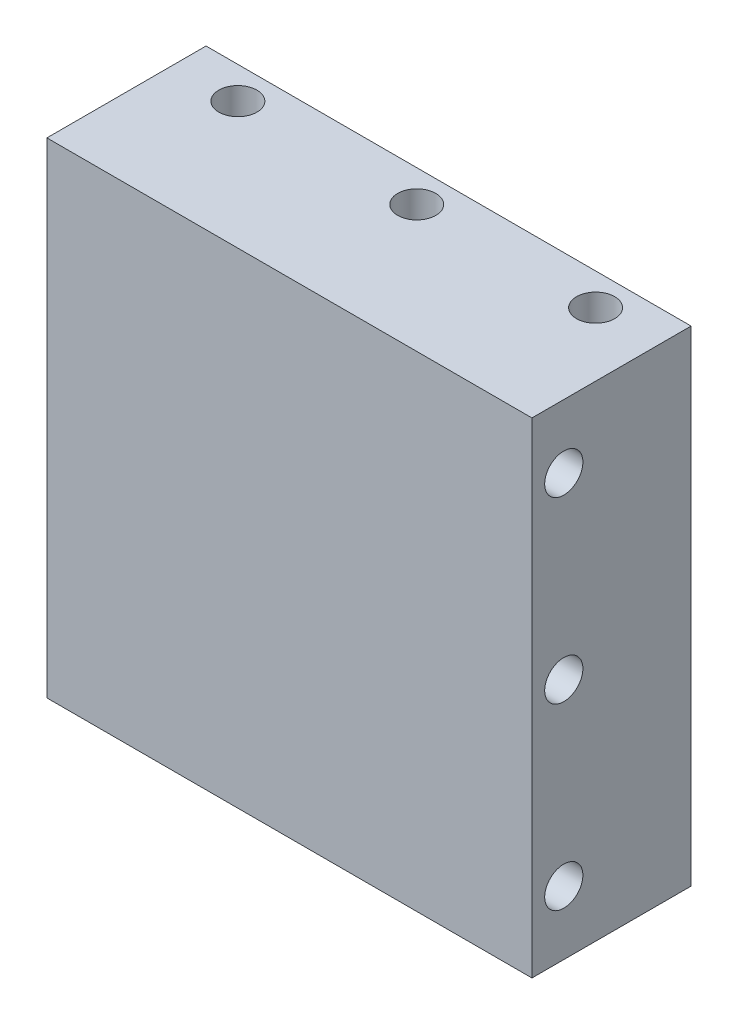
ISO-10303-21;
HEADER;
FILE_DESCRIPTION(('STEP AP214'),'2;1');
FILE_NAME('part.step','',(''),(''),'','','');
FILE_SCHEMA(('AUTOMOTIVE_DESIGN { 1 0 10303 214 1 1 1 1 }'));
ENDSEC;
DATA;
#1=APPLICATION_CONTEXT('core data for automotive mechanical design processes');
#2=APPLICATION_PROTOCOL_DEFINITION('international standard','automotive_design',2000,#1);
#3=PRODUCT_CONTEXT('',#1,'mechanical');
#4=PRODUCT('Part','Part','',(#3));
#5=PRODUCT_RELATED_PRODUCT_CATEGORY('part','',(#4));
#6=PRODUCT_DEFINITION_FORMATION('','',#4);
#7=PRODUCT_DEFINITION_CONTEXT('part definition',#1,'design');
#8=PRODUCT_DEFINITION('design','',#6,#7);
#9=PRODUCT_DEFINITION_SHAPE('','',#8);
#10=(LENGTH_UNIT() NAMED_UNIT(*) SI_UNIT(.MILLI.,.METRE.));
#11=(NAMED_UNIT(*) PLANE_ANGLE_UNIT() SI_UNIT($,.RADIAN.));
#12=(NAMED_UNIT(*) SI_UNIT($,.STERADIAN.) SOLID_ANGLE_UNIT());
#13=UNCERTAINTY_MEASURE_WITH_UNIT(LENGTH_MEASURE(1.E-05),#10,'distance_accuracy_value','');
#14=(GEOMETRIC_REPRESENTATION_CONTEXT(3) GLOBAL_UNCERTAINTY_ASSIGNED_CONTEXT((#13)) GLOBAL_UNIT_ASSIGNED_CONTEXT((#10,
#11,#12)) REPRESENTATION_CONTEXT('',''));
#15=CARTESIAN_POINT('',(0.,0.,0.));
#16=DIRECTION('',(0.,0.,1.));
#17=DIRECTION('',(1.,0.,0.));
#18=AXIS2_PLACEMENT_3D('',#15,#16,#17);
#19=CARTESIAN_POINT('',(76.2,76.2,50.));
#20=DIRECTION('',(-1.,0.,0.));
#21=DIRECTION('',(0.,-1.,0.));
#22=AXIS2_PLACEMENT_3D('',#19,#20,#21);
#23=PLANE('',#22);
#24=CARTESIAN_POINT('',(76.2,56.2,40.));
#25=DIRECTION('',(1.,0.,0.));
#26=DIRECTION('',(0.,1.,0.));
#27=AXIS2_PLACEMENT_3D('',#24,#25,#26);
#28=CIRCLE('',#27,5.99999999999999);
#29=CARTESIAN_POINT('',(76.2,62.2,40.));
#30=VERTEX_POINT('',#29);
#31=EDGE_CURVE('E129',#30,#30,#28,.T.);
#32=ORIENTED_EDGE('',*,*,#31,.F.);
#33=EDGE_LOOP('',(#32));
#34=FACE_BOUND('',#33,.T.);
#35=CARTESIAN_POINT('',(76.2,0.,40.));
#36=DIRECTION('',(1.,0.,0.));
#37=DIRECTION('',(0.,1.,0.));
#38=AXIS2_PLACEMENT_3D('',#35,#36,#37);
#39=CIRCLE('',#38,5.99999999999999);
#40=CARTESIAN_POINT('',(76.2,6.00000000000002,40.));
#41=VERTEX_POINT('',#40);
#42=EDGE_CURVE('E123',#41,#41,#39,.T.);
#43=ORIENTED_EDGE('',*,*,#42,.F.);
#44=EDGE_LOOP('',(#43));
#45=FACE_BOUND('',#44,.T.);
#46=CARTESIAN_POINT('',(76.2,-56.2,40.));
#47=DIRECTION('',(1.,0.,0.));
#48=DIRECTION('',(0.,1.,0.));
#49=AXIS2_PLACEMENT_3D('',#46,#47,#48);
#50=CIRCLE('',#49,6.00000000000001);
#51=CARTESIAN_POINT('',(76.2,-50.2,40.));
#52=VERTEX_POINT('',#51);
#53=EDGE_CURVE('E116',#52,#52,#50,.T.);
#54=ORIENTED_EDGE('',*,*,#53,.F.);
#55=EDGE_LOOP('',(#54));
#56=FACE_BOUND('',#55,.T.);
#57=DIRECTION('',(0.,1.,0.));
#58=VECTOR('',#57,1.);
#59=CARTESIAN_POINT('',(76.2,76.2,0.));
#60=LINE('',#59,#58);
#61=CARTESIAN_POINT('',(76.2,-76.2,0.));
#62=VERTEX_POINT('',#61);
#63=CARTESIAN_POINT('',(76.2,76.2,0.));
#64=VERTEX_POINT('',#63);
#65=EDGE_CURVE('E102',#62,#64,#60,.T.);
#66=ORIENTED_EDGE('',*,*,#65,.T.);
#67=DIRECTION('',(0.,0.,-1.));
#68=VECTOR('',#67,1.);
#69=CARTESIAN_POINT('',(76.2,76.2,50.));
#70=LINE('',#69,#68);
#71=CARTESIAN_POINT('',(76.2,76.2,50.));
#72=VERTEX_POINT('',#71);
#73=EDGE_CURVE('E11',#72,#64,#70,.T.);
#74=ORIENTED_EDGE('',*,*,#73,.F.);
#75=DIRECTION('',(0.,1.,0.));
#76=VECTOR('',#75,1.);
#77=CARTESIAN_POINT('',(76.2,76.2,50.));
#78=LINE('',#77,#76);
#79=CARTESIAN_POINT('',(76.2,-76.2,50.));
#80=VERTEX_POINT('',#79);
#81=EDGE_CURVE('E90',#80,#72,#78,.T.);
#82=ORIENTED_EDGE('',*,*,#81,.F.);
#83=DIRECTION('',(0.,0.,-1.));
#84=VECTOR('',#83,1.);
#85=CARTESIAN_POINT('',(76.2,-76.2,50.));
#86=LINE('',#85,#84);
#87=EDGE_CURVE('E98',#80,#62,#86,.T.);
#88=ORIENTED_EDGE('',*,*,#87,.T.);
#89=EDGE_LOOP('',(#66,#74,#82,#88));
#90=FACE_BOUND('',#89,.T.);
#91=ADVANCED_FACE('F39',(#34,#45,#56,#90),#23,.F.);
#92=CARTESIAN_POINT('',(-76.2,76.2,50.));
#93=DIRECTION('',(0.,-1.,0.));
#94=DIRECTION('',(0.,0.,-1.));
#95=AXIS2_PLACEMENT_3D('',#92,#93,#94);
#96=PLANE('',#95);
#97=CARTESIAN_POINT('',(-56.2,76.2,10.));
#98=DIRECTION('',(0.,1.,0.));
#99=DIRECTION('',(0.,0.,1.));
#100=AXIS2_PLACEMENT_3D('',#97,#98,#99);
#101=CIRCLE('',#100,6.);
#102=CARTESIAN_POINT('',(-56.2,76.2,16.));
#103=VERTEX_POINT('',#102);
#104=EDGE_CURVE('E146',#103,#103,#101,.T.);
#105=ORIENTED_EDGE('',*,*,#104,.F.);
#106=EDGE_LOOP('',(#105));
#107=FACE_BOUND('',#106,.T.);
#108=CARTESIAN_POINT('',(0.,76.2,10.));
#109=DIRECTION('',(0.,1.,0.));
#110=DIRECTION('',(0.,0.,1.));
#111=AXIS2_PLACEMENT_3D('',#108,#109,#110);
#112=CIRCLE('',#111,6.);
#113=CARTESIAN_POINT('',(0.,76.2,16.));
#114=VERTEX_POINT('',#113);
#115=EDGE_CURVE('E140',#114,#114,#112,.T.);
#116=ORIENTED_EDGE('',*,*,#115,.F.);
#117=EDGE_LOOP('',(#116));
#118=FACE_BOUND('',#117,.T.);
#119=CARTESIAN_POINT('',(56.2,76.2,10.));
#120=DIRECTION('',(0.,1.,0.));
#121=DIRECTION('',(0.,0.,1.));
#122=AXIS2_PLACEMENT_3D('',#119,#120,#121);
#123=CIRCLE('',#122,6.);
#124=CARTESIAN_POINT('',(56.2,76.2,16.));
#125=VERTEX_POINT('',#124);
#126=EDGE_CURVE('E134',#125,#125,#123,.T.);
#127=ORIENTED_EDGE('',*,*,#126,.F.);
#128=EDGE_LOOP('',(#127));
#129=FACE_BOUND('',#128,.T.);
#130=DIRECTION('',(-1.,0.,0.));
#131=VECTOR('',#130,1.);
#132=CARTESIAN_POINT('',(-76.2,76.2,0.));
#133=LINE('',#132,#131);
#134=CARTESIAN_POINT('',(-76.2,76.2,0.));
#135=VERTEX_POINT('',#134);
#136=EDGE_CURVE('E94',#64,#135,#133,.T.);
#137=ORIENTED_EDGE('',*,*,#136,.T.);
#138=DIRECTION('',(0.,0.,-1.));
#139=VECTOR('',#138,1.);
#140=CARTESIAN_POINT('',(-76.2,76.2,50.));
#141=LINE('',#140,#139);
#142=CARTESIAN_POINT('',(-76.2,76.2,50.));
#143=VERTEX_POINT('',#142);
#144=EDGE_CURVE('E47',#143,#135,#141,.T.);
#145=ORIENTED_EDGE('',*,*,#144,.F.);
#146=DIRECTION('',(-1.,0.,0.));
#147=VECTOR('',#146,1.);
#148=CARTESIAN_POINT('',(-76.2,76.2,50.));
#149=LINE('',#148,#147);
#150=EDGE_CURVE('E85',#72,#143,#149,.T.);
#151=ORIENTED_EDGE('',*,*,#150,.F.);
#152=ORIENTED_EDGE('',*,*,#73,.T.);
#153=EDGE_LOOP('',(#137,#145,#151,#152));
#154=FACE_BOUND('',#153,.T.);
#155=ADVANCED_FACE('F93',(#107,#118,#129,#154),#96,.F.);
#156=CARTESIAN_POINT('',(-76.2,76.2,50.));
#157=DIRECTION('',(1.,0.,0.));
#158=DIRECTION('',(0.,1.,0.));
#159=AXIS2_PLACEMENT_3D('',#156,#157,#158);
#160=PLANE('',#159);
#161=CARTESIAN_POINT('',(-76.2,56.2,40.));
#162=DIRECTION('',(1.,0.,0.));
#163=DIRECTION('',(0.,1.,0.));
#164=AXIS2_PLACEMENT_3D('',#161,#162,#163);
#165=CIRCLE('',#164,5.99999999999999);
#166=CARTESIAN_POINT('',(-76.2,62.2,40.));
#167=VERTEX_POINT('',#166);
#168=EDGE_CURVE('E105',#167,#167,#165,.T.);
#169=ORIENTED_EDGE('',*,*,#168,.T.);
#170=EDGE_LOOP('',(#169));
#171=FACE_BOUND('',#170,.T.);
#172=CARTESIAN_POINT('',(-76.2,0.,40.));
#173=DIRECTION('',(1.,0.,0.));
#174=DIRECTION('',(0.,1.,0.));
#175=AXIS2_PLACEMENT_3D('',#172,#173,#174);
#176=CIRCLE('',#175,5.99999999999999);
#177=CARTESIAN_POINT('',(-76.2,6.,40.));
#178=VERTEX_POINT('',#177);
#179=EDGE_CURVE('E126',#178,#178,#176,.T.);
#180=ORIENTED_EDGE('',*,*,#179,.T.);
#181=EDGE_LOOP('',(#180));
#182=FACE_BOUND('',#181,.T.);
#183=CARTESIAN_POINT('',(-76.2,-56.2,40.));
#184=DIRECTION('',(1.,0.,0.));
#185=DIRECTION('',(0.,1.,0.));
#186=AXIS2_PLACEMENT_3D('',#183,#184,#185);
#187=CIRCLE('',#186,6.00000000000001);
#188=CARTESIAN_POINT('',(-76.2,-50.2,40.));
#189=VERTEX_POINT('',#188);
#190=EDGE_CURVE('E119',#189,#189,#187,.T.);
#191=ORIENTED_EDGE('',*,*,#190,.T.);
#192=EDGE_LOOP('',(#191));
#193=FACE_BOUND('',#192,.T.);
#194=DIRECTION('',(0.,-1.,0.));
#195=VECTOR('',#194,1.);
#196=CARTESIAN_POINT('',(-76.2,76.2,0.));
#197=LINE('',#196,#195);
#198=CARTESIAN_POINT('',(-76.2,-76.2,0.));
#199=VERTEX_POINT('',#198);
#200=EDGE_CURVE('E72',#135,#199,#197,.T.);
#201=ORIENTED_EDGE('',*,*,#200,.T.);
#202=DIRECTION('',(0.,0.,-1.));
#203=VECTOR('',#202,1.);
#204=CARTESIAN_POINT('',(-76.2,-76.2,50.));
#205=LINE('',#204,#203);
#206=CARTESIAN_POINT('',(-76.2,-76.2,50.));
#207=VERTEX_POINT('',#206);
#208=EDGE_CURVE('E95',#207,#199,#205,.T.);
#209=ORIENTED_EDGE('',*,*,#208,.F.);
#210=DIRECTION('',(0.,-1.,0.));
#211=VECTOR('',#210,1.);
#212=CARTESIAN_POINT('',(-76.2,76.2,50.));
#213=LINE('',#212,#211);
#214=EDGE_CURVE('E88',#143,#207,#213,.T.);
#215=ORIENTED_EDGE('',*,*,#214,.F.);
#216=ORIENTED_EDGE('',*,*,#144,.T.);
#217=EDGE_LOOP('',(#201,#209,#215,#216));
#218=FACE_BOUND('',#217,.T.);
#219=ADVANCED_FACE('F96',(#171,#182,#193,#218),#160,.F.);
#220=CARTESIAN_POINT('',(-76.2,-76.2,50.));
#221=DIRECTION('',(0.,1.,0.));
#222=DIRECTION('',(0.,0.,1.));
#223=AXIS2_PLACEMENT_3D('',#220,#221,#222);
#224=PLANE('',#223);
#225=CARTESIAN_POINT('',(-56.2,-76.2,10.));
#226=DIRECTION('',(0.,1.,0.));
#227=DIRECTION('',(0.,0.,1.));
#228=AXIS2_PLACEMENT_3D('',#225,#226,#227);
#229=CIRCLE('',#228,6.);
#230=CARTESIAN_POINT('',(-56.2,-76.2,16.));
#231=VERTEX_POINT('',#230);
#232=EDGE_CURVE('E120',#231,#231,#229,.T.);
#233=ORIENTED_EDGE('',*,*,#232,.T.);
#234=EDGE_LOOP('',(#233));
#235=FACE_BOUND('',#234,.T.);
#236=CARTESIAN_POINT('',(0.,-76.2,10.));
#237=DIRECTION('',(0.,1.,0.));
#238=DIRECTION('',(0.,0.,1.));
#239=AXIS2_PLACEMENT_3D('',#236,#237,#238);
#240=CIRCLE('',#239,6.);
#241=CARTESIAN_POINT('',(0.,-76.2,16.));
#242=VERTEX_POINT('',#241);
#243=EDGE_CURVE('E143',#242,#242,#240,.T.);
#244=ORIENTED_EDGE('',*,*,#243,.T.);
#245=EDGE_LOOP('',(#244));
#246=FACE_BOUND('',#245,.T.);
#247=CARTESIAN_POINT('',(56.2,-76.2,10.));
#248=DIRECTION('',(0.,1.,0.));
#249=DIRECTION('',(0.,0.,1.));
#250=AXIS2_PLACEMENT_3D('',#247,#248,#249);
#251=CIRCLE('',#250,6.);
#252=CARTESIAN_POINT('',(56.2,-76.2,16.));
#253=VERTEX_POINT('',#252);
#254=EDGE_CURVE('E137',#253,#253,#251,.T.);
#255=ORIENTED_EDGE('',*,*,#254,.T.);
#256=EDGE_LOOP('',(#255));
#257=FACE_BOUND('',#256,.T.);
#258=DIRECTION('',(1.,0.,0.));
#259=VECTOR('',#258,1.);
#260=CARTESIAN_POINT('',(-76.2,-76.2,0.));
#261=LINE('',#260,#259);
#262=EDGE_CURVE('E78',#199,#62,#261,.T.);
#263=ORIENTED_EDGE('',*,*,#262,.T.);
#264=ORIENTED_EDGE('',*,*,#87,.F.);
#265=DIRECTION('',(1.,0.,0.));
#266=VECTOR('',#265,1.);
#267=CARTESIAN_POINT('',(-76.2,-76.2,50.));
#268=LINE('',#267,#266);
#269=EDGE_CURVE('E55',#207,#80,#268,.T.);
#270=ORIENTED_EDGE('',*,*,#269,.F.);
#271=ORIENTED_EDGE('',*,*,#208,.T.);
#272=EDGE_LOOP('',(#263,#264,#270,#271));
#273=FACE_BOUND('',#272,.T.);
#274=ADVANCED_FACE('F110',(#235,#246,#257,#273),#224,.F.);
#275=CARTESIAN_POINT('',(0.,0.,50.));
#276=DIRECTION('',(0.,0.,1.));
#277=DIRECTION('',(1.,0.,0.));
#278=AXIS2_PLACEMENT_3D('',#275,#276,#277);
#279=PLANE('',#278);
#280=ORIENTED_EDGE('',*,*,#81,.T.);
#281=ORIENTED_EDGE('',*,*,#150,.T.);
#282=ORIENTED_EDGE('',*,*,#214,.T.);
#283=ORIENTED_EDGE('',*,*,#269,.T.);
#284=EDGE_LOOP('',(#280,#281,#282,#283));
#285=FACE_BOUND('',#284,.T.);
#286=ADVANCED_FACE('F86',(#285),#279,.T.);
#287=CARTESIAN_POINT('',(0.,0.,0.));
#288=DIRECTION('',(0.,0.,1.));
#289=DIRECTION('',(1.,0.,0.));
#290=AXIS2_PLACEMENT_3D('',#287,#288,#289);
#291=PLANE('',#290);
#292=ORIENTED_EDGE('',*,*,#65,.F.);
#293=ORIENTED_EDGE('',*,*,#262,.F.);
#294=ORIENTED_EDGE('',*,*,#200,.F.);
#295=ORIENTED_EDGE('',*,*,#136,.F.);
#296=EDGE_LOOP('',(#292,#293,#294,#295));
#297=FACE_BOUND('',#296,.T.);
#298=ADVANCED_FACE('F113',(#297),#291,.F.);
#299=CARTESIAN_POINT('',(-76.2,-56.2,40.));
#300=DIRECTION('',(1.,0.,0.));
#301=DIRECTION('',(0.,1.,0.));
#302=AXIS2_PLACEMENT_3D('',#299,#300,#301);
#303=CYLINDRICAL_SURFACE('',#302,6.00000000000001);
#304=ORIENTED_EDGE('',*,*,#190,.F.);
#305=EDGE_LOOP('',(#304));
#306=FACE_BOUND('',#305,.T.);
#307=ORIENTED_EDGE('',*,*,#53,.T.);
#308=EDGE_LOOP('',(#307));
#309=FACE_BOUND('',#308,.T.);
#310=ADVANCED_FACE('F192',(#306,#309),#303,.F.);
#311=CARTESIAN_POINT('',(-76.2,0.,40.));
#312=DIRECTION('',(1.,0.,0.));
#313=DIRECTION('',(0.,1.,0.));
#314=AXIS2_PLACEMENT_3D('',#311,#312,#313);
#315=CYLINDRICAL_SURFACE('',#314,5.99999999999999);
#316=ORIENTED_EDGE('',*,*,#179,.F.);
#317=EDGE_LOOP('',(#316));
#318=FACE_BOUND('',#317,.T.);
#319=ORIENTED_EDGE('',*,*,#42,.T.);
#320=EDGE_LOOP('',(#319));
#321=FACE_BOUND('',#320,.T.);
#322=ADVANCED_FACE('F178',(#318,#321),#315,.F.);
#323=CARTESIAN_POINT('',(-76.2,56.2,40.));
#324=DIRECTION('',(1.,0.,0.));
#325=DIRECTION('',(0.,1.,0.));
#326=AXIS2_PLACEMENT_3D('',#323,#324,#325);
#327=CYLINDRICAL_SURFACE('',#326,5.99999999999999);
#328=ORIENTED_EDGE('',*,*,#168,.F.);
#329=EDGE_LOOP('',(#328));
#330=FACE_BOUND('',#329,.T.);
#331=ORIENTED_EDGE('',*,*,#31,.T.);
#332=EDGE_LOOP('',(#331));
#333=FACE_BOUND('',#332,.T.);
#334=ADVANCED_FACE('F169',(#330,#333),#327,.F.);
#335=CARTESIAN_POINT('',(56.2,-76.2,10.));
#336=DIRECTION('',(0.,1.,0.));
#337=DIRECTION('',(0.,0.,1.));
#338=AXIS2_PLACEMENT_3D('',#335,#336,#337);
#339=CYLINDRICAL_SURFACE('',#338,6.);
#340=CARTESIAN_POINT('',(56.2,-76.2,16.));
#341=CARTESIAN_POINT('',(56.2,-74.6125,16.));
#342=CARTESIAN_POINT('',(56.2,-73.025,16.));
#343=CARTESIAN_POINT('',(56.2,-69.85,16.));
#344=CARTESIAN_POINT('',(56.2,-68.2625,16.));
#345=CARTESIAN_POINT('',(56.2,-65.0875,16.));
#346=CARTESIAN_POINT('',(56.2,-63.5,16.));
#347=CARTESIAN_POINT('',(56.2,-60.325,16.));
#348=CARTESIAN_POINT('',(56.2,-58.7375,16.));
#349=CARTESIAN_POINT('',(56.2,-55.5625,16.));
#350=CARTESIAN_POINT('',(56.2,-53.975,16.));
#351=CARTESIAN_POINT('',(56.2,-50.8,16.));
#352=CARTESIAN_POINT('',(56.2,-49.2125,16.));
#353=CARTESIAN_POINT('',(56.2,-46.0375,16.));
#354=CARTESIAN_POINT('',(56.2,-44.45,16.));
#355=CARTESIAN_POINT('',(56.2,-41.275,16.));
#356=CARTESIAN_POINT('',(56.2,-39.6875,16.));
#357=CARTESIAN_POINT('',(56.2,-36.5125,16.));
#358=CARTESIAN_POINT('',(56.2,-34.925,16.));
#359=CARTESIAN_POINT('',(56.2,-31.75,16.));
#360=CARTESIAN_POINT('',(56.2,-30.1625,16.));
#361=CARTESIAN_POINT('',(56.2,-26.9875,16.));
#362=CARTESIAN_POINT('',(56.2,-25.4,16.));
#363=CARTESIAN_POINT('',(56.2,-22.225,16.));
#364=CARTESIAN_POINT('',(56.2,-20.6375,16.));
#365=CARTESIAN_POINT('',(56.2,-17.4625,16.));
#366=CARTESIAN_POINT('',(56.2,-15.875,16.));
#367=CARTESIAN_POINT('',(56.2,-12.7,16.));
#368=CARTESIAN_POINT('',(56.2,-11.1125,16.));
#369=CARTESIAN_POINT('',(56.2,-7.93749999999999,16.));
#370=CARTESIAN_POINT('',(56.2,-6.34999999999999,16.));
#371=CARTESIAN_POINT('',(56.2,-3.17499999999999,16.));
#372=CARTESIAN_POINT('',(56.2,-1.58749999999999,16.));
#373=CARTESIAN_POINT('',(56.2,1.58750000000001,16.));
#374=CARTESIAN_POINT('',(56.2,3.17500000000002,16.));
#375=CARTESIAN_POINT('',(56.2,6.35000000000002,16.));
#376=CARTESIAN_POINT('',(56.2,7.93750000000002,16.));
#377=CARTESIAN_POINT('',(56.2,11.1125,16.));
#378=CARTESIAN_POINT('',(56.2,12.7,16.));
#379=CARTESIAN_POINT('',(56.2,15.875,16.));
#380=CARTESIAN_POINT('',(56.2,17.4625,16.));
#381=CARTESIAN_POINT('',(56.2,20.6375,16.));
#382=CARTESIAN_POINT('',(56.2,22.225,16.));
#383=CARTESIAN_POINT('',(56.2,25.4,16.));
#384=CARTESIAN_POINT('',(56.2,26.9875,16.));
#385=CARTESIAN_POINT('',(56.2,30.1625,16.));
#386=CARTESIAN_POINT('',(56.2,31.75,16.));
#387=CARTESIAN_POINT('',(56.2,34.925,16.));
#388=CARTESIAN_POINT('',(56.2,36.5125,16.));
#389=CARTESIAN_POINT('',(56.2,39.6875,16.));
#390=CARTESIAN_POINT('',(56.2,41.275,16.));
#391=CARTESIAN_POINT('',(56.2,44.45,16.));
#392=CARTESIAN_POINT('',(56.2,46.0375,16.));
#393=CARTESIAN_POINT('',(56.2,49.2125,16.));
#394=CARTESIAN_POINT('',(56.2,50.8,16.));
#395=CARTESIAN_POINT('',(56.2,53.975,16.));
#396=CARTESIAN_POINT('',(56.2,55.5625,16.));
#397=CARTESIAN_POINT('',(56.2,58.7375,16.));
#398=CARTESIAN_POINT('',(56.2,60.325,16.));
#399=CARTESIAN_POINT('',(56.2,63.5,16.));
#400=CARTESIAN_POINT('',(56.2,65.0875,16.));
#401=CARTESIAN_POINT('',(56.2,68.2625,16.));
#402=CARTESIAN_POINT('',(56.2,69.85,16.));
#403=CARTESIAN_POINT('',(56.2,73.025,16.));
#404=CARTESIAN_POINT('',(56.2,74.6125,16.));
#405=CARTESIAN_POINT('',(56.2,76.2,16.));
#406=B_SPLINE_CURVE_WITH_KNOTS('',3,(#340,#341,#342,#343,#344,#345,#346,#347,#348,#349,#350,
#351,#352,#353,#354,#355,#356,#357,#358,#359,#360,#361,#362,#363,#364,#365,#366,#367,#368,#369,
#370,#371,#372,#373,#374,#375,#376,#377,#378,#379,#380,#381,#382,#383,#384,#385,#386,#387,#388,
#389,#390,#391,#392,#393,#394,#395,#396,#397,#398,#399,#400,#401,#402,#403,#404,#405),
.UNSPECIFIED.,.F.,.F.,(4,2,2,2,2,2,2,2,2,2,2,2,2,2,2,2,2,2,2,2,2,2,2,2,2,2,2,2,2,2,2,2,4),(0.,
4.7625,9.52500000000001,14.2875,19.05,23.8125,28.575,33.3375,38.1,42.8625,47.625,52.3875,57.15,
61.9125,66.675,71.4375,76.2,80.9625,85.725,90.4875,95.25,100.0125,104.775,109.5375,114.3,
119.0625,123.825,128.5875,133.35,138.1125,142.875,147.6375,152.4),.UNSPECIFIED.);
#407=EDGE_CURVE('BSEAM167',#253,#125,#406,.T.);
#408=ORIENTED_EDGE('',*,*,#254,.F.);
#409=ORIENTED_EDGE('',*,*,#126,.T.);
#410=ORIENTED_EDGE('',*,*,#407,.T.);
#411=ORIENTED_EDGE('',*,*,#407,.F.);
#412=EDGE_LOOP('',(#408,#410,#409,#411));
#413=FACE_BOUND('',#412,.T.);
#414=ADVANCED_FACE('F167',(#413),#339,.F.);
#415=CARTESIAN_POINT('',(0.,-76.2,10.));
#416=DIRECTION('',(0.,1.,0.));
#417=DIRECTION('',(0.,0.,1.));
#418=AXIS2_PLACEMENT_3D('',#415,#416,#417);
#419=CYLINDRICAL_SURFACE('',#418,6.);
#420=CARTESIAN_POINT('',(0.,-76.2,16.));
#421=CARTESIAN_POINT('',(0.,-74.6125,16.));
#422=CARTESIAN_POINT('',(0.,-73.025,16.));
#423=CARTESIAN_POINT('',(0.,-69.85,16.));
#424=CARTESIAN_POINT('',(0.,-68.2625,16.));
#425=CARTESIAN_POINT('',(0.,-65.0875,16.));
#426=CARTESIAN_POINT('',(0.,-63.5,16.));
#427=CARTESIAN_POINT('',(0.,-60.325,16.));
#428=CARTESIAN_POINT('',(0.,-58.7375,16.));
#429=CARTESIAN_POINT('',(0.,-55.5625,16.));
#430=CARTESIAN_POINT('',(0.,-53.975,16.));
#431=CARTESIAN_POINT('',(0.,-50.8,16.));
#432=CARTESIAN_POINT('',(0.,-49.2125,16.));
#433=CARTESIAN_POINT('',(0.,-46.0375,16.));
#434=CARTESIAN_POINT('',(0.,-44.45,16.));
#435=CARTESIAN_POINT('',(0.,-41.275,16.));
#436=CARTESIAN_POINT('',(0.,-39.6875,16.));
#437=CARTESIAN_POINT('',(0.,-36.5125,16.));
#438=CARTESIAN_POINT('',(0.,-34.925,16.));
#439=CARTESIAN_POINT('',(0.,-31.75,16.));
#440=CARTESIAN_POINT('',(0.,-30.1625,16.));
#441=CARTESIAN_POINT('',(0.,-26.9875,16.));
#442=CARTESIAN_POINT('',(0.,-25.4,16.));
#443=CARTESIAN_POINT('',(0.,-22.225,16.));
#444=CARTESIAN_POINT('',(0.,-20.6375,16.));
#445=CARTESIAN_POINT('',(0.,-17.4625,16.));
#446=CARTESIAN_POINT('',(0.,-15.875,16.));
#447=CARTESIAN_POINT('',(0.,-12.7,16.));
#448=CARTESIAN_POINT('',(0.,-11.1125,16.));
#449=CARTESIAN_POINT('',(0.,-7.93749999999999,16.));
#450=CARTESIAN_POINT('',(0.,-6.34999999999999,16.));
#451=CARTESIAN_POINT('',(0.,-3.17499999999999,16.));
#452=CARTESIAN_POINT('',(0.,-1.58749999999999,16.));
#453=CARTESIAN_POINT('',(0.,1.58750000000001,16.));
#454=CARTESIAN_POINT('',(0.,3.17500000000002,16.));
#455=CARTESIAN_POINT('',(0.,6.35000000000002,16.));
#456=CARTESIAN_POINT('',(0.,7.93750000000002,16.));
#457=CARTESIAN_POINT('',(0.,11.1125,16.));
#458=CARTESIAN_POINT('',(0.,12.7,16.));
#459=CARTESIAN_POINT('',(0.,15.875,16.));
#460=CARTESIAN_POINT('',(0.,17.4625,16.));
#461=CARTESIAN_POINT('',(0.,20.6375,16.));
#462=CARTESIAN_POINT('',(0.,22.225,16.));
#463=CARTESIAN_POINT('',(0.,25.4,16.));
#464=CARTESIAN_POINT('',(0.,26.9875,16.));
#465=CARTESIAN_POINT('',(0.,30.1625,16.));
#466=CARTESIAN_POINT('',(0.,31.75,16.));
#467=CARTESIAN_POINT('',(0.,34.925,16.));
#468=CARTESIAN_POINT('',(0.,36.5125,16.));
#469=CARTESIAN_POINT('',(0.,39.6875,16.));
#470=CARTESIAN_POINT('',(0.,41.275,16.));
#471=CARTESIAN_POINT('',(0.,44.45,16.));
#472=CARTESIAN_POINT('',(0.,46.0375,16.));
#473=CARTESIAN_POINT('',(0.,49.2125,16.));
#474=CARTESIAN_POINT('',(0.,50.8,16.));
#475=CARTESIAN_POINT('',(0.,53.975,16.));
#476=CARTESIAN_POINT('',(0.,55.5625,16.));
#477=CARTESIAN_POINT('',(0.,58.7375,16.));
#478=CARTESIAN_POINT('',(0.,60.325,16.));
#479=CARTESIAN_POINT('',(0.,63.5,16.));
#480=CARTESIAN_POINT('',(0.,65.0875,16.));
#481=CARTESIAN_POINT('',(0.,68.2625,16.));
#482=CARTESIAN_POINT('',(0.,69.85,16.));
#483=CARTESIAN_POINT('',(0.,73.025,16.));
#484=CARTESIAN_POINT('',(0.,74.6125,16.));
#485=CARTESIAN_POINT('',(0.,76.2,16.));
#486=B_SPLINE_CURVE_WITH_KNOTS('',3,(#420,#421,#422,#423,#424,#425,#426,#427,#428,#429,#430,
#431,#432,#433,#434,#435,#436,#437,#438,#439,#440,#441,#442,#443,#444,#445,#446,#447,#448,#449,
#450,#451,#452,#453,#454,#455,#456,#457,#458,#459,#460,#461,#462,#463,#464,#465,#466,#467,#468,
#469,#470,#471,#472,#473,#474,#475,#476,#477,#478,#479,#480,#481,#482,#483,#484,#485),
.UNSPECIFIED.,.F.,.F.,(4,2,2,2,2,2,2,2,2,2,2,2,2,2,2,2,2,2,2,2,2,2,2,2,2,2,2,2,2,2,2,2,4),(0.,
4.7625,9.52500000000001,14.2875,19.05,23.8125,28.575,33.3375,38.1,42.8625,47.625,52.3875,57.15,
61.9125,66.675,71.4375,76.2,80.9625,85.725,90.4875,95.25,100.0125,104.775,109.5375,114.3,
119.0625,123.825,128.5875,133.35,138.1125,142.875,147.6375,152.4),.UNSPECIFIED.);
#487=EDGE_CURVE('BSEAM157',#242,#114,#486,.T.);
#488=ORIENTED_EDGE('',*,*,#243,.F.);
#489=ORIENTED_EDGE('',*,*,#115,.T.);
#490=ORIENTED_EDGE('',*,*,#487,.T.);
#491=ORIENTED_EDGE('',*,*,#487,.F.);
#492=EDGE_LOOP('',(#488,#490,#489,#491));
#493=FACE_BOUND('',#492,.T.);
#494=ADVANCED_FACE('F157',(#493),#419,.F.);
#495=CARTESIAN_POINT('',(-56.2,-76.2,10.));
#496=DIRECTION('',(0.,1.,0.));
#497=DIRECTION('',(0.,0.,1.));
#498=AXIS2_PLACEMENT_3D('',#495,#496,#497);
#499=CYLINDRICAL_SURFACE('',#498,6.);
#500=CARTESIAN_POINT('',(-56.2,-76.2,16.));
#501=CARTESIAN_POINT('',(-56.2,-74.6125,16.));
#502=CARTESIAN_POINT('',(-56.2,-73.025,16.));
#503=CARTESIAN_POINT('',(-56.2,-69.85,16.));
#504=CARTESIAN_POINT('',(-56.2,-68.2625,16.));
#505=CARTESIAN_POINT('',(-56.2,-65.0875,16.));
#506=CARTESIAN_POINT('',(-56.2,-63.5,16.));
#507=CARTESIAN_POINT('',(-56.2,-60.325,16.));
#508=CARTESIAN_POINT('',(-56.2,-58.7375,16.));
#509=CARTESIAN_POINT('',(-56.2,-55.5625,16.));
#510=CARTESIAN_POINT('',(-56.2,-53.975,16.));
#511=CARTESIAN_POINT('',(-56.2,-50.8,16.));
#512=CARTESIAN_POINT('',(-56.2,-49.2125,16.));
#513=CARTESIAN_POINT('',(-56.2,-46.0375,16.));
#514=CARTESIAN_POINT('',(-56.2,-44.45,16.));
#515=CARTESIAN_POINT('',(-56.2,-41.275,16.));
#516=CARTESIAN_POINT('',(-56.2,-39.6875,16.));
#517=CARTESIAN_POINT('',(-56.2,-36.5125,16.));
#518=CARTESIAN_POINT('',(-56.2,-34.925,16.));
#519=CARTESIAN_POINT('',(-56.2,-31.75,16.));
#520=CARTESIAN_POINT('',(-56.2,-30.1625,16.));
#521=CARTESIAN_POINT('',(-56.2,-26.9875,16.));
#522=CARTESIAN_POINT('',(-56.2,-25.4,16.));
#523=CARTESIAN_POINT('',(-56.2,-22.225,16.));
#524=CARTESIAN_POINT('',(-56.2,-20.6375,16.));
#525=CARTESIAN_POINT('',(-56.2,-17.4625,16.));
#526=CARTESIAN_POINT('',(-56.2,-15.875,16.));
#527=CARTESIAN_POINT('',(-56.2,-12.7,16.));
#528=CARTESIAN_POINT('',(-56.2,-11.1125,16.));
#529=CARTESIAN_POINT('',(-56.2,-7.93749999999999,16.));
#530=CARTESIAN_POINT('',(-56.2,-6.34999999999999,16.));
#531=CARTESIAN_POINT('',(-56.2,-3.17499999999999,16.));
#532=CARTESIAN_POINT('',(-56.2,-1.58749999999999,16.));
#533=CARTESIAN_POINT('',(-56.2,1.58750000000001,16.));
#534=CARTESIAN_POINT('',(-56.2,3.17500000000002,16.));
#535=CARTESIAN_POINT('',(-56.2,6.35000000000002,16.));
#536=CARTESIAN_POINT('',(-56.2,7.93750000000002,16.));
#537=CARTESIAN_POINT('',(-56.2,11.1125,16.));
#538=CARTESIAN_POINT('',(-56.2,12.7,16.));
#539=CARTESIAN_POINT('',(-56.2,15.875,16.));
#540=CARTESIAN_POINT('',(-56.2,17.4625,16.));
#541=CARTESIAN_POINT('',(-56.2,20.6375,16.));
#542=CARTESIAN_POINT('',(-56.2,22.225,16.));
#543=CARTESIAN_POINT('',(-56.2,25.4,16.));
#544=CARTESIAN_POINT('',(-56.2,26.9875,16.));
#545=CARTESIAN_POINT('',(-56.2,30.1625,16.));
#546=CARTESIAN_POINT('',(-56.2,31.75,16.));
#547=CARTESIAN_POINT('',(-56.2,34.925,16.));
#548=CARTESIAN_POINT('',(-56.2,36.5125,16.));
#549=CARTESIAN_POINT('',(-56.2,39.6875,16.));
#550=CARTESIAN_POINT('',(-56.2,41.275,16.));
#551=CARTESIAN_POINT('',(-56.2,44.45,16.));
#552=CARTESIAN_POINT('',(-56.2,46.0375,16.));
#553=CARTESIAN_POINT('',(-56.2,49.2125,16.));
#554=CARTESIAN_POINT('',(-56.2,50.8,16.));
#555=CARTESIAN_POINT('',(-56.2,53.975,16.));
#556=CARTESIAN_POINT('',(-56.2,55.5625,16.));
#557=CARTESIAN_POINT('',(-56.2,58.7375,16.));
#558=CARTESIAN_POINT('',(-56.2,60.325,16.));
#559=CARTESIAN_POINT('',(-56.2,63.5,16.));
#560=CARTESIAN_POINT('',(-56.2,65.0875,16.));
#561=CARTESIAN_POINT('',(-56.2,68.2625,16.));
#562=CARTESIAN_POINT('',(-56.2,69.85,16.));
#563=CARTESIAN_POINT('',(-56.2,73.025,16.));
#564=CARTESIAN_POINT('',(-56.2,74.6125,16.));
#565=CARTESIAN_POINT('',(-56.2,76.2,16.));
#566=B_SPLINE_CURVE_WITH_KNOTS('',3,(#500,#501,#502,#503,#504,#505,#506,#507,#508,#509,#510,
#511,#512,#513,#514,#515,#516,#517,#518,#519,#520,#521,#522,#523,#524,#525,#526,#527,#528,#529,
#530,#531,#532,#533,#534,#535,#536,#537,#538,#539,#540,#541,#542,#543,#544,#545,#546,#547,#548,
#549,#550,#551,#552,#553,#554,#555,#556,#557,#558,#559,#560,#561,#562,#563,#564,#565),
.UNSPECIFIED.,.F.,.F.,(4,2,2,2,2,2,2,2,2,2,2,2,2,2,2,2,2,2,2,2,2,2,2,2,2,2,2,2,2,2,2,2,4),(0.,
4.7625,9.52500000000001,14.2875,19.05,23.8125,28.575,33.3375,38.1,42.8625,47.625,52.3875,57.15,
61.9125,66.675,71.4375,76.2,80.9625,85.725,90.4875,95.25,100.0125,104.775,109.5375,114.3,
119.0625,123.825,128.5875,133.35,138.1125,142.875,147.6375,152.4),.UNSPECIFIED.);
#567=EDGE_CURVE('BSEAM154',#231,#103,#566,.T.);
#568=ORIENTED_EDGE('',*,*,#232,.F.);
#569=ORIENTED_EDGE('',*,*,#104,.T.);
#570=ORIENTED_EDGE('',*,*,#567,.T.);
#571=ORIENTED_EDGE('',*,*,#567,.F.);
#572=EDGE_LOOP('',(#568,#570,#569,#571));
#573=FACE_BOUND('',#572,.T.);
#574=ADVANCED_FACE('F154',(#573),#499,.F.);
#575=CLOSED_SHELL('',(#91,#155,#219,#274,#286,#298,#310,#322,#334,#414,#494,#574));
#576=MANIFOLD_SOLID_BREP('B2',#575);
#577=ADVANCED_BREP_SHAPE_REPRESENTATION('',(#18,#576),#14);
#578=SHAPE_DEFINITION_REPRESENTATION(#9,#577);
ENDSEC;
END-ISO-10303-21;
